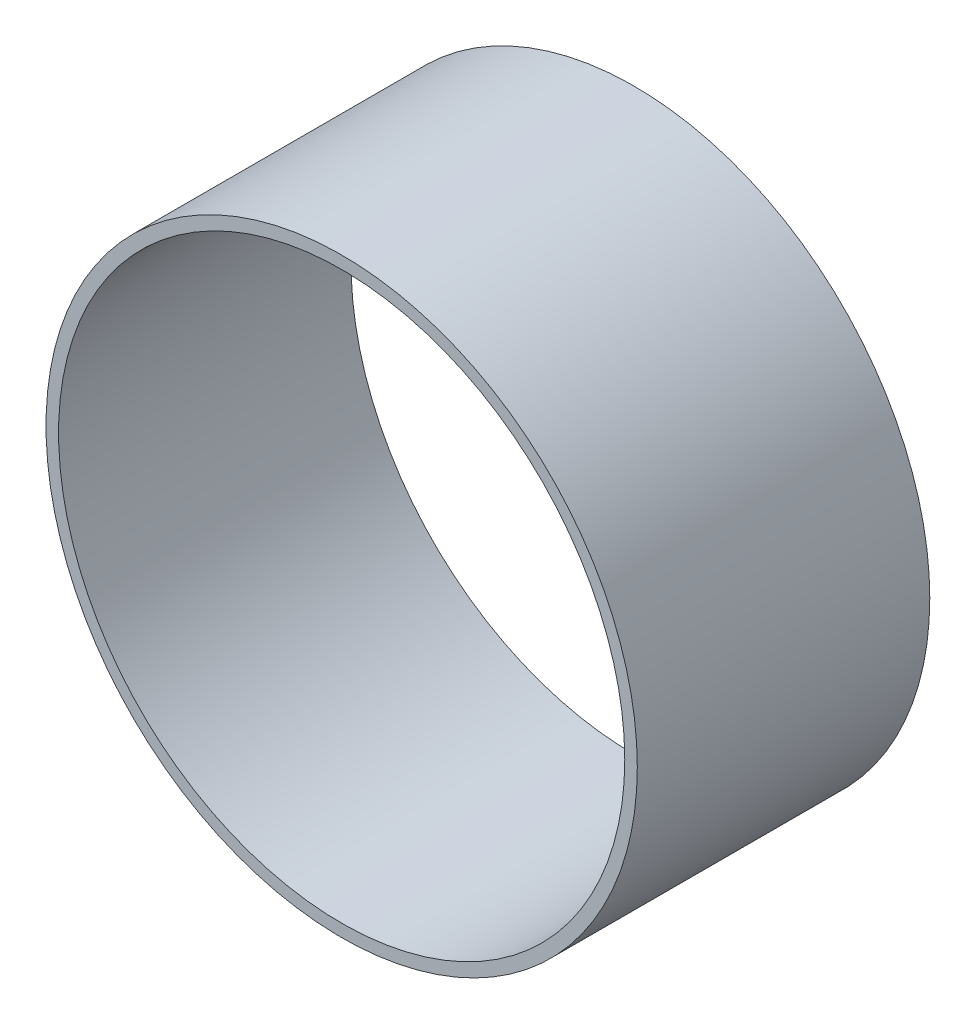
ISO-10303-21;
HEADER;
FILE_DESCRIPTION(('STEP AP214'),'2;1');
FILE_NAME('part.step','',(''),(''),'','','');
FILE_SCHEMA(('AUTOMOTIVE_DESIGN { 1 0 10303 214 1 1 1 1 }'));
ENDSEC;
DATA;
#1=APPLICATION_CONTEXT('core data for automotive mechanical design processes');
#2=APPLICATION_PROTOCOL_DEFINITION('international standard','automotive_design',2000,#1);
#3=PRODUCT_CONTEXT('',#1,'mechanical');
#4=PRODUCT('Part','Part','',(#3));
#5=PRODUCT_RELATED_PRODUCT_CATEGORY('part','',(#4));
#6=PRODUCT_DEFINITION_FORMATION('','',#4);
#7=PRODUCT_DEFINITION_CONTEXT('part definition',#1,'design');
#8=PRODUCT_DEFINITION('design','',#6,#7);
#9=PRODUCT_DEFINITION_SHAPE('','',#8);
#10=(LENGTH_UNIT() NAMED_UNIT(*) SI_UNIT(.MILLI.,.METRE.));
#11=(NAMED_UNIT(*) PLANE_ANGLE_UNIT() SI_UNIT($,.RADIAN.));
#12=(NAMED_UNIT(*) SI_UNIT($,.STERADIAN.) SOLID_ANGLE_UNIT());
#13=UNCERTAINTY_MEASURE_WITH_UNIT(LENGTH_MEASURE(1.E-05),#10,'distance_accuracy_value','');
#14=(GEOMETRIC_REPRESENTATION_CONTEXT(3) GLOBAL_UNCERTAINTY_ASSIGNED_CONTEXT((#13)) GLOBAL_UNIT_ASSIGNED_CONTEXT((#10,
#11,#12)) REPRESENTATION_CONTEXT('',''));
#15=CARTESIAN_POINT('',(0.,0.,0.));
#16=DIRECTION('',(0.,0.,1.));
#17=DIRECTION('',(1.,0.,0.));
#18=AXIS2_PLACEMENT_3D('',#15,#16,#17);
#19=CARTESIAN_POINT('',(0.,0.,35.));
#20=DIRECTION('',(0.,0.,1.));
#21=DIRECTION('',(1.,0.,0.));
#22=AXIS2_PLACEMENT_3D('',#19,#20,#21);
#23=PLANE('',#22);
#24=CARTESIAN_POINT('',(0.,0.,35.));
#25=DIRECTION('',(0.,0.,1.));
#26=DIRECTION('',(1.,0.,0.));
#27=AXIS2_PLACEMENT_3D('',#24,#25,#26);
#28=CIRCLE('',#27,70.7538461538462);
#29=CARTESIAN_POINT('',(70.7538461538462,0.,35.));
#30=VERTEX_POINT('',#29);
#31=EDGE_CURVE('E10',#30,#30,#28,.T.);
#32=ORIENTED_EDGE('',*,*,#31,.T.);
#33=EDGE_LOOP('',(#32));
#34=FACE_BOUND('',#33,.T.);
#35=CARTESIAN_POINT('',(0.,0.,35.));
#36=DIRECTION('',(0.,0.,1.));
#37=DIRECTION('',(1.,0.,0.));
#38=AXIS2_PLACEMENT_3D('',#35,#36,#37);
#39=CIRCLE('',#38,67.7538461538462);
#40=CARTESIAN_POINT('',(67.7538461538462,0.,35.));
#41=VERTEX_POINT('',#40);
#42=EDGE_CURVE('E46',#41,#41,#39,.T.);
#43=ORIENTED_EDGE('',*,*,#42,.F.);
#44=EDGE_LOOP('',(#43));
#45=FACE_BOUND('',#44,.T.);
#46=ADVANCED_FACE('F35',(#34,#45),#23,.T.);
#47=CARTESIAN_POINT('',(0.,0.,-35.));
#48=DIRECTION('',(0.,0.,1.));
#49=DIRECTION('',(1.,0.,0.));
#50=AXIS2_PLACEMENT_3D('',#47,#48,#49);
#51=PLANE('',#50);
#52=CARTESIAN_POINT('',(0.,0.,-35.));
#53=DIRECTION('',(0.,0.,1.));
#54=DIRECTION('',(1.,0.,0.));
#55=AXIS2_PLACEMENT_3D('',#52,#53,#54);
#56=CIRCLE('',#55,70.7538461538462);
#57=CARTESIAN_POINT('',(70.7538461538462,0.,-35.));
#58=VERTEX_POINT('',#57);
#59=EDGE_CURVE('E39',#58,#58,#56,.T.);
#60=ORIENTED_EDGE('',*,*,#59,.F.);
#61=EDGE_LOOP('',(#60));
#62=FACE_BOUND('',#61,.T.);
#63=CARTESIAN_POINT('',(0.,0.,-35.));
#64=DIRECTION('',(0.,0.,1.));
#65=DIRECTION('',(1.,0.,0.));
#66=AXIS2_PLACEMENT_3D('',#63,#64,#65);
#67=CIRCLE('',#66,67.7538461538462);
#68=CARTESIAN_POINT('',(67.7538461538462,0.,-35.));
#69=VERTEX_POINT('',#68);
#70=EDGE_CURVE('E48',#69,#69,#67,.T.);
#71=ORIENTED_EDGE('',*,*,#70,.T.);
#72=EDGE_LOOP('',(#71));
#73=FACE_BOUND('',#72,.T.);
#74=ADVANCED_FACE('F58',(#62,#73),#51,.F.);
#75=CARTESIAN_POINT('',(0.,0.,35.));
#76=DIRECTION('',(0.,0.,-1.));
#77=DIRECTION('',(-1.,0.,0.));
#78=AXIS2_PLACEMENT_3D('',#75,#76,#77);
#79=CYLINDRICAL_SURFACE('',#78,70.7538461538462);
#80=ORIENTED_EDGE('',*,*,#31,.F.);
#81=EDGE_LOOP('',(#80));
#82=FACE_BOUND('',#81,.T.);
#83=ORIENTED_EDGE('',*,*,#59,.T.);
#84=EDGE_LOOP('',(#83));
#85=FACE_BOUND('',#84,.T.);
#86=ADVANCED_FACE('F37',(#82,#85),#79,.T.);
#87=CARTESIAN_POINT('',(0.,0.,35.));
#88=DIRECTION('',(0.,0.,-1.));
#89=DIRECTION('',(-1.,0.,0.));
#90=AXIS2_PLACEMENT_3D('',#87,#88,#89);
#91=CYLINDRICAL_SURFACE('',#90,67.7538461538462);
#92=ORIENTED_EDGE('',*,*,#42,.T.);
#93=EDGE_LOOP('',(#92));
#94=FACE_BOUND('',#93,.T.);
#95=ORIENTED_EDGE('',*,*,#70,.F.);
#96=EDGE_LOOP('',(#95));
#97=FACE_BOUND('',#96,.T.);
#98=ADVANCED_FACE('F54',(#94,#97),#91,.F.);
#99=CLOSED_SHELL('',(#46,#74,#86,#98));
#100=MANIFOLD_SOLID_BREP('B2',#99);
#101=ADVANCED_BREP_SHAPE_REPRESENTATION('',(#18,#100),#14);
#102=SHAPE_DEFINITION_REPRESENTATION(#9,#101);
ENDSEC;
END-ISO-10303-21;
